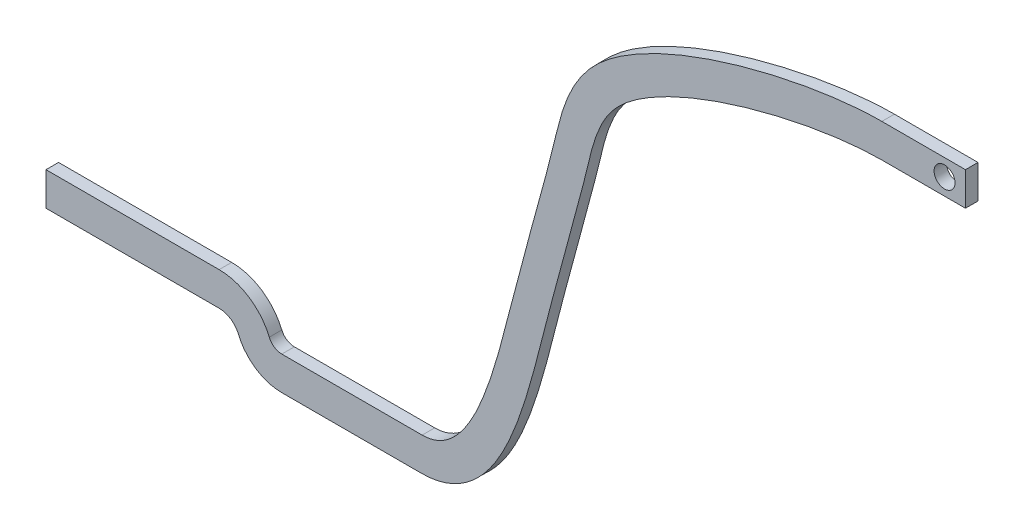
ISO-10303-21;
HEADER;
FILE_DESCRIPTION(('STEP AP214'),'2;1');
FILE_NAME('part.step','',(''),(''),'','','');
FILE_SCHEMA(('AUTOMOTIVE_DESIGN { 1 0 10303 214 1 1 1 1 }'));
ENDSEC;
DATA;
#1=APPLICATION_CONTEXT('core data for automotive mechanical design processes');
#2=APPLICATION_PROTOCOL_DEFINITION('international standard','automotive_design',2000,#1);
#3=PRODUCT_CONTEXT('',#1,'mechanical');
#4=PRODUCT('Part','Part','',(#3));
#5=PRODUCT_RELATED_PRODUCT_CATEGORY('part','',(#4));
#6=PRODUCT_DEFINITION_FORMATION('','',#4);
#7=PRODUCT_DEFINITION_CONTEXT('part definition',#1,'design');
#8=PRODUCT_DEFINITION('design','',#6,#7);
#9=PRODUCT_DEFINITION_SHAPE('','',#8);
#10=(LENGTH_UNIT() NAMED_UNIT(*) SI_UNIT(.MILLI.,.METRE.));
#11=(NAMED_UNIT(*) PLANE_ANGLE_UNIT() SI_UNIT($,.RADIAN.));
#12=(NAMED_UNIT(*) SI_UNIT($,.STERADIAN.) SOLID_ANGLE_UNIT());
#13=UNCERTAINTY_MEASURE_WITH_UNIT(LENGTH_MEASURE(1.E-05),#10,'distance_accuracy_value','');
#14=(GEOMETRIC_REPRESENTATION_CONTEXT(3) GLOBAL_UNCERTAINTY_ASSIGNED_CONTEXT((#13)) GLOBAL_UNIT_ASSIGNED_CONTEXT((#10,
#11,#12)) REPRESENTATION_CONTEXT('',''));
#15=CARTESIAN_POINT('',(0.,0.,0.));
#16=DIRECTION('',(0.,0.,1.));
#17=DIRECTION('',(1.,0.,0.));
#18=AXIS2_PLACEMENT_3D('',#15,#16,#17);
#19=CARTESIAN_POINT('',(0.,0.,3.));
#20=DIRECTION('',(1.,0.,0.));
#21=DIRECTION('',(0.,1.,0.));
#22=AXIS2_PLACEMENT_3D('',#19,#20,#21);
#23=PLANE('',#22);
#24=DIRECTION('',(0.,-1.,0.));
#25=VECTOR('',#24,1.);
#26=CARTESIAN_POINT('',(0.,0.,0.));
#27=LINE('',#26,#25);
#28=CARTESIAN_POINT('',(0.,0.,0.));
#29=VERTEX_POINT('',#28);
#30=CARTESIAN_POINT('',(0.,-8.,0.));
#31=VERTEX_POINT('',#30);
#32=EDGE_CURVE('E166',#29,#31,#27,.T.);
#33=ORIENTED_EDGE('',*,*,#32,.T.);
#34=DIRECTION('',(0.,0.,-1.));
#35=VECTOR('',#34,1.);
#36=CARTESIAN_POINT('',(0.,-8.,3.));
#37=LINE('',#36,#35);
#38=CARTESIAN_POINT('',(0.,-8.,3.));
#39=VERTEX_POINT('',#38);
#40=EDGE_CURVE('E11',#39,#31,#37,.T.);
#41=ORIENTED_EDGE('',*,*,#40,.F.);
#42=DIRECTION('',(0.,-1.,0.));
#43=VECTOR('',#42,1.);
#44=CARTESIAN_POINT('',(0.,0.,3.));
#45=LINE('',#44,#43);
#46=CARTESIAN_POINT('',(0.,0.,3.));
#47=VERTEX_POINT('',#46);
#48=EDGE_CURVE('E210',#47,#39,#45,.T.);
#49=ORIENTED_EDGE('',*,*,#48,.F.);
#50=DIRECTION('',(0.,0.,-1.));
#51=VECTOR('',#50,1.);
#52=CARTESIAN_POINT('',(0.,0.,3.));
#53=LINE('',#52,#51);
#54=EDGE_CURVE('E49',#47,#29,#53,.T.);
#55=ORIENTED_EDGE('',*,*,#54,.T.);
#56=EDGE_LOOP('',(#33,#41,#49,#55));
#57=FACE_BOUND('',#56,.T.);
#58=ADVANCED_FACE('F33',(#57),#23,.F.);
#59=CARTESIAN_POINT('',(0.,-8.,3.));
#60=DIRECTION('',(0.,1.,0.));
#61=DIRECTION('',(-1.,0.,0.));
#62=AXIS2_PLACEMENT_3D('',#59,#60,#61);
#63=PLANE('',#62);
#64=DIRECTION('',(1.,0.,0.));
#65=VECTOR('',#64,1.);
#66=CARTESIAN_POINT('',(0.,-8.,0.));
#67=LINE('',#66,#65);
#68=CARTESIAN_POINT('',(41.4247575020263,-8.,0.));
#69=VERTEX_POINT('',#68);
#70=EDGE_CURVE('E168',#31,#69,#67,.T.);
#71=ORIENTED_EDGE('',*,*,#70,.T.);
#72=DIRECTION('',(0.,0.,-1.));
#73=VECTOR('',#72,1.);
#74=CARTESIAN_POINT('',(41.4247575020263,-8.,3.));
#75=LINE('',#74,#73);
#76=CARTESIAN_POINT('',(41.4247575020263,-8.,3.));
#77=VERTEX_POINT('',#76);
#78=EDGE_CURVE('E41',#77,#69,#75,.T.);
#79=ORIENTED_EDGE('',*,*,#78,.F.);
#80=DIRECTION('',(1.,0.,0.));
#81=VECTOR('',#80,1.);
#82=CARTESIAN_POINT('',(0.,-8.,3.));
#83=LINE('',#82,#81);
#84=EDGE_CURVE('E105',#39,#77,#83,.T.);
#85=ORIENTED_EDGE('',*,*,#84,.F.);
#86=ORIENTED_EDGE('',*,*,#40,.T.);
#87=EDGE_LOOP('',(#71,#79,#85,#86));
#88=FACE_BOUND('',#87,.T.);
#89=ADVANCED_FACE('F283',(#88),#63,.F.);
#90=CARTESIAN_POINT('',(41.4247575020263,-13.,3.));
#91=DIRECTION('',(0.,0.,-1.));
#92=DIRECTION('',(-1.,0.,0.));
#93=AXIS2_PLACEMENT_3D('',#90,#91,#92);
#94=CYLINDRICAL_SURFACE('',#93,5.);
#95=CARTESIAN_POINT('',(41.4247575020263,-13.,0.));
#96=DIRECTION('',(0.,0.,-1.));
#97=DIRECTION('',(-1.,0.,0.));
#98=AXIS2_PLACEMENT_3D('',#95,#96,#97);
#99=CIRCLE('',#98,5.);
#100=CARTESIAN_POINT('',(46.040142117411,-11.0769230769231,0.));
#101=VERTEX_POINT('',#100);
#102=EDGE_CURVE('E171',#69,#101,#99,.T.);
#103=ORIENTED_EDGE('',*,*,#102,.T.);
#104=DIRECTION('',(0.,0.,-1.));
#105=VECTOR('',#104,1.);
#106=CARTESIAN_POINT('',(46.040142117411,-11.0769230769231,3.));
#107=LINE('',#106,#105);
#108=CARTESIAN_POINT('',(46.040142117411,-11.0769230769231,3.));
#109=VERTEX_POINT('',#108);
#110=EDGE_CURVE('E231',#109,#101,#107,.T.);
#111=ORIENTED_EDGE('',*,*,#110,.F.);
#112=CARTESIAN_POINT('',(41.4247575020263,-13.,3.));
#113=DIRECTION('',(0.,0.,-1.));
#114=DIRECTION('',(-1.,0.,0.));
#115=AXIS2_PLACEMENT_3D('',#112,#113,#114);
#116=CIRCLE('',#115,5.);
#117=EDGE_CURVE('E239',#77,#109,#116,.T.);
#118=ORIENTED_EDGE('',*,*,#117,.F.);
#119=ORIENTED_EDGE('',*,*,#78,.T.);
#120=EDGE_LOOP('',(#103,#111,#118,#119));
#121=FACE_BOUND('',#120,.T.);
#122=ADVANCED_FACE('F237',(#121),#94,.F.);
#123=CARTESIAN_POINT('',(56.4247574581034,-6.75000001830122,3.));
#124=DIRECTION('',(0.,0.,-1.));
#125=DIRECTION('',(-1.,0.,0.));
#126=AXIS2_PLACEMENT_3D('',#123,#124,#125);
#127=CYLINDRICAL_SURFACE('',#126,11.2499999524168);
#128=CARTESIAN_POINT('',(56.4247574581034,-6.75000001830122,0.));
#129=DIRECTION('',(0.,0.,1.));
#130=DIRECTION('',(1.,0.,0.));
#131=AXIS2_PLACEMENT_3D('',#128,#129,#130);
#132=CIRCLE('',#131,11.2499999524168);
#133=CARTESIAN_POINT('',(56.4247574581034,-17.9999999707181,0.));
#134=VERTEX_POINT('',#133);
#135=EDGE_CURVE('E173',#101,#134,#132,.T.);
#136=ORIENTED_EDGE('',*,*,#135,.T.);
#137=DIRECTION('',(0.,0.,-1.));
#138=VECTOR('',#137,1.);
#139=CARTESIAN_POINT('',(56.4247574581034,-17.9999999707181,3.));
#140=LINE('',#139,#138);
#141=CARTESIAN_POINT('',(56.4247574581034,-17.9999999707181,3.));
#142=VERTEX_POINT('',#141);
#143=EDGE_CURVE('E228',#142,#134,#140,.T.);
#144=ORIENTED_EDGE('',*,*,#143,.F.);
#145=CARTESIAN_POINT('',(56.4247574581034,-6.75000001830122,3.));
#146=DIRECTION('',(0.,0.,1.));
#147=DIRECTION('',(1.,0.,0.));
#148=AXIS2_PLACEMENT_3D('',#145,#146,#147);
#149=CIRCLE('',#148,11.2499999524168);
#150=EDGE_CURVE('E256',#109,#142,#149,.T.);
#151=ORIENTED_EDGE('',*,*,#150,.F.);
#152=ORIENTED_EDGE('',*,*,#110,.T.);
#153=EDGE_LOOP('',(#136,#144,#151,#152));
#154=FACE_BOUND('',#153,.T.);
#155=ADVANCED_FACE('F247',(#154),#127,.T.);
#156=CARTESIAN_POINT('',(56.4247574581034,-17.9999999707181,3.));
#157=DIRECTION('',(0.,1.,0.));
#158=DIRECTION('',(0.,0.,1.));
#159=AXIS2_PLACEMENT_3D('',#156,#157,#158);
#160=PLANE('',#159);
#161=DIRECTION('',(1.,0.,0.));
#162=VECTOR('',#161,1.);
#163=CARTESIAN_POINT('',(56.4247574581034,-17.9999999707181,0.));
#164=LINE('',#163,#162);
#165=CARTESIAN_POINT('',(89.7568384061287,-17.9999999707181,0.));
#166=VERTEX_POINT('',#165);
#167=EDGE_CURVE('E175',#134,#166,#164,.T.);
#168=ORIENTED_EDGE('',*,*,#167,.T.);
#169=DIRECTION('',(0.,0.,-1.));
#170=VECTOR('',#169,1.);
#171=CARTESIAN_POINT('',(89.7568384061287,-17.9999999707181,3.));
#172=LINE('',#171,#170);
#173=CARTESIAN_POINT('',(89.7568384061287,-17.9999999707181,3.));
#174=VERTEX_POINT('',#173);
#175=EDGE_CURVE('E225',#174,#166,#172,.T.);
#176=ORIENTED_EDGE('',*,*,#175,.F.);
#177=DIRECTION('',(1.,0.,0.));
#178=VECTOR('',#177,1.);
#179=CARTESIAN_POINT('',(56.4247574581034,-17.9999999707181,3.));
#180=LINE('',#179,#178);
#181=EDGE_CURVE('E253',#142,#174,#180,.T.);
#182=ORIENTED_EDGE('',*,*,#181,.F.);
#183=ORIENTED_EDGE('',*,*,#143,.T.);
#184=EDGE_LOOP('',(#168,#176,#182,#183));
#185=FACE_BOUND('',#184,.T.);
#186=ADVANCED_FACE('F251',(#185),#160,.F.);
#187=CARTESIAN_POINT('',(89.7568384061287,-17.9999999707181,3.));
#188=CARTESIAN_POINT('',(89.8130917953654,-17.9999999707181,3.));
#189=CARTESIAN_POINT('',(89.9023489366075,-17.9999160095133,3.));
#190=CARTESIAN_POINT('',(90.0018502287152,-18.0001399060593,3.));
#191=CARTESIAN_POINT('',(90.2310859563055,-17.9991712431685,3.));
#192=CARTESIAN_POINT('',(90.4729508911273,-17.9945024665527,3.));
#193=CARTESIAN_POINT('',(90.8841416796012,-17.9801542162149,3.));
#194=CARTESIAN_POINT('',(91.3881278747203,-17.9490844411562,3.));
#195=CARTESIAN_POINT('',(92.1947585178213,-17.8715614192402,3.));
#196=CARTESIAN_POINT('',(93.1904500807991,-17.7228676596242,3.));
#197=CARTESIAN_POINT('',(94.7507448217479,-17.3781896295835,3.));
#198=CARTESIAN_POINT('',(96.6187354886936,-16.7576735377139,3.));
#199=CARTESIAN_POINT('',(99.3770892643854,-15.4234498958376,3.));
#200=CARTESIAN_POINT('',(102.343197713656,-13.2590682721257,3.));
#201=CARTESIAN_POINT('',(106.17490080248,-9.1892750607975,3.));
#202=CARTESIAN_POINT('',(109.735071262154,-3.38671783364758,3.));
#203=CARTESIAN_POINT('',(112.961674589915,4.24643864543277,3.));
#204=CARTESIAN_POINT('',(115.514327900771,12.179197087228,3.));
#205=CARTESIAN_POINT('',(117.251666845729,18.6295501585535,3.));
#206=CARTESIAN_POINT('',(118.474102134264,23.4122051084266,3.));
#207=CARTESIAN_POINT('',(119.602496230846,27.8231118813068,3.));
#208=CARTESIAN_POINT('',(120.898538707965,32.7925609769524,3.));
#209=CARTESIAN_POINT('',(122.284194923136,38.0013127138926,3.));
#210=CARTESIAN_POINT('',(123.943196149883,44.1257145868726,3.));
#211=CARTESIAN_POINT('',(125.369626288269,49.2900964405528,3.));
#212=CARTESIAN_POINT('',(126.66639279542,54.0396640218425,3.));
#213=CARTESIAN_POINT('',(127.59755822836,57.5238674831548,3.));
#214=CARTESIAN_POINT('',(128.358235989521,60.4702597519119,3.));
#215=CARTESIAN_POINT('',(128.966266021768,62.9054224339843,3.));
#216=CARTESIAN_POINT('',(129.429299712865,64.806090195796,3.));
#217=CARTESIAN_POINT('',(129.883035302883,66.7129030321821,3.));
#218=CARTESIAN_POINT('',(130.492374677473,69.1710238981108,3.));
#219=CARTESIAN_POINT('',(131.670627829012,73.3006930437622,3.));
#220=CARTESIAN_POINT('',(133.543133303097,77.4976440574227,3.));
#221=CARTESIAN_POINT('',(136.170909387328,80.8434015218557,3.));
#222=CARTESIAN_POINT('',(138.117867338206,82.7220877727008,3.));
#223=CARTESIAN_POINT('',(140.506133762764,84.6808821665961,3.));
#224=CARTESIAN_POINT('',(144.208061635852,87.1527292751961,3.));
#225=CARTESIAN_POINT('',(149.590597904857,90.0085545042913,3.));
#226=CARTESIAN_POINT('',(155.679808934853,92.6582574887067,3.));
#227=CARTESIAN_POINT('',(162.257603089206,95.0444001444545,3.));
#228=CARTESIAN_POINT('',(169.111801490595,97.1263121647057,3.));
#229=CARTESIAN_POINT('',(176.035239222022,98.8731488050805,3.));
#230=CARTESIAN_POINT('',(182.821256281701,100.259557815344,3.));
#231=CARTESIAN_POINT('',(188.187246712887,101.096565943295,3.));
#232=CARTESIAN_POINT('',(192.194993207786,101.566634814564,3.));
#233=CARTESIAN_POINT('',(195.030088806438,101.818031656257,3.));
#234=CARTESIAN_POINT('',(197.217185842128,101.942662864324,3.));
#235=CARTESIAN_POINT('',(198.857928811693,101.991927711802,3.));
#236=CARTESIAN_POINT('',(199.613923387014,102.000004856737,3.));
#237=CARTESIAN_POINT('',(200.,102.000004856737,3.));
#238=B_SPLINE_CURVE_WITH_KNOTS('',3,(#187,#188,#189,#190,#191,#192,#193,#194,#195,#196,#197,
#198,#199,#200,#201,#202,#203,#204,#205,#206,#207,#208,#209,#210,#211,#212,#213,#214,#215,#216,
#217,#218,#219,#220,#221,#222,#223,#224,#225,#226,#227,#228,#229,#230,#231,#232,#233,#234,#235,
#236,#237),.UNSPECIFIED.,.F.,.F.,(4,1,1,1,1,1,1,1,1,1,1,1,1,1,1,1,1,1,1,1,1,1,1,1,1,1,1,1,1,1,1,
1,1,1,1,1,1,1,1,1,1,1,1,1,1,1,1,1,4),(-0.00140908308889591,-0.000431144531191907,
5.78247476600933E-05,0.000546794026512093,0.00152473258421609,0.00250267114192009,
0.00445854825732809,0.00641442537273609,0.0103261796035521,0.0142379338343681,
0.0220614422960001,0.0298849507576321,0.0455319676808961,0.0611789846041601,0.0924730184506881,
0.123767052297216,0.155061086143744,0.186355119990272,0.202002136913536,0.2176491538368,
0.248943187683328,0.280237221529856,0.311531255376384,0.37411932306944,0.405413356915968,
0.436707390762496,0.468001424609024,0.483648441532288,0.499295458455552,0.514942475378816,
0.53058949230208,0.561883526148608,0.624471593841664,0.655765627688192,0.671412644611456,
0.68705966153472,0.718353695381248,0.749647729227776,0.780941763074304,0.812235796920832,
0.84352983076736,0.874823864613888,0.906117898460416,0.937411932306944,0.953058949230208,
0.968705966153472,0.984352983076736,0.992176491538368,1.),.UNSPECIFIED.);
#239=DIRECTION('',(0.,0.,-1.));
#240=VECTOR('',#239,1.);
#241=SURFACE_OF_LINEAR_EXTRUSION('',#238,#240);
#242=CARTESIAN_POINT('',(89.7568384061287,-17.9999999707181,0.));
#243=CARTESIAN_POINT('',(89.8130917953654,-17.9999999707181,0.));
#244=CARTESIAN_POINT('',(89.9023489366075,-17.9999160095133,0.));
#245=CARTESIAN_POINT('',(90.0018502287152,-18.0001399060593,0.));
#246=CARTESIAN_POINT('',(90.2310859563055,-17.9991712431685,0.));
#247=CARTESIAN_POINT('',(90.4729508911273,-17.9945024665527,0.));
#248=CARTESIAN_POINT('',(90.8841416796012,-17.9801542162149,0.));
#249=CARTESIAN_POINT('',(91.3881278747203,-17.9490844411562,0.));
#250=CARTESIAN_POINT('',(92.1947585178213,-17.8715614192402,0.));
#251=CARTESIAN_POINT('',(93.1904500807991,-17.7228676596242,0.));
#252=CARTESIAN_POINT('',(94.7507448217479,-17.3781896295835,0.));
#253=CARTESIAN_POINT('',(96.6187354886936,-16.7576735377139,0.));
#254=CARTESIAN_POINT('',(99.3770892643854,-15.4234498958376,0.));
#255=CARTESIAN_POINT('',(102.343197713656,-13.2590682721257,0.));
#256=CARTESIAN_POINT('',(106.17490080248,-9.1892750607975,0.));
#257=CARTESIAN_POINT('',(109.735071262154,-3.38671783364758,0.));
#258=CARTESIAN_POINT('',(112.961674589915,4.24643864543277,0.));
#259=CARTESIAN_POINT('',(115.514327900771,12.179197087228,0.));
#260=CARTESIAN_POINT('',(117.251666845729,18.6295501585535,0.));
#261=CARTESIAN_POINT('',(118.474102134264,23.4122051084266,0.));
#262=CARTESIAN_POINT('',(119.602496230846,27.8231118813068,0.));
#263=CARTESIAN_POINT('',(120.898538707965,32.7925609769524,0.));
#264=CARTESIAN_POINT('',(122.284194923136,38.0013127138926,0.));
#265=CARTESIAN_POINT('',(123.943196149883,44.1257145868726,0.));
#266=CARTESIAN_POINT('',(125.369626288269,49.2900964405528,0.));
#267=CARTESIAN_POINT('',(126.66639279542,54.0396640218425,0.));
#268=CARTESIAN_POINT('',(127.59755822836,57.5238674831548,0.));
#269=CARTESIAN_POINT('',(128.358235989521,60.4702597519119,0.));
#270=CARTESIAN_POINT('',(128.966266021768,62.9054224339843,0.));
#271=CARTESIAN_POINT('',(129.429299712865,64.806090195796,0.));
#272=CARTESIAN_POINT('',(129.883035302883,66.7129030321821,0.));
#273=CARTESIAN_POINT('',(130.492374677473,69.1710238981108,0.));
#274=CARTESIAN_POINT('',(131.670627829012,73.3006930437622,0.));
#275=CARTESIAN_POINT('',(133.543133303097,77.4976440574227,0.));
#276=CARTESIAN_POINT('',(136.170909387328,80.8434015218557,0.));
#277=CARTESIAN_POINT('',(138.117867338206,82.7220877727008,0.));
#278=CARTESIAN_POINT('',(140.506133762764,84.6808821665961,0.));
#279=CARTESIAN_POINT('',(144.208061635852,87.1527292751961,0.));
#280=CARTESIAN_POINT('',(149.590597904857,90.0085545042913,0.));
#281=CARTESIAN_POINT('',(155.679808934853,92.6582574887067,0.));
#282=CARTESIAN_POINT('',(162.257603089206,95.0444001444545,0.));
#283=CARTESIAN_POINT('',(169.111801490595,97.1263121647057,0.));
#284=CARTESIAN_POINT('',(176.035239222022,98.8731488050805,0.));
#285=CARTESIAN_POINT('',(182.821256281701,100.259557815344,0.));
#286=CARTESIAN_POINT('',(188.187246712887,101.096565943295,0.));
#287=CARTESIAN_POINT('',(192.194993207786,101.566634814564,0.));
#288=CARTESIAN_POINT('',(195.030088806438,101.818031656257,0.));
#289=CARTESIAN_POINT('',(197.217185842128,101.942662864324,0.));
#290=CARTESIAN_POINT('',(198.857928811693,101.991927711802,0.));
#291=CARTESIAN_POINT('',(199.613923387014,102.000004856737,0.));
#292=CARTESIAN_POINT('',(200.,102.000004856737,0.));
#293=B_SPLINE_CURVE_WITH_KNOTS('',3,(#242,#243,#244,#245,#246,#247,#248,#249,#250,#251,#252,
#253,#254,#255,#256,#257,#258,#259,#260,#261,#262,#263,#264,#265,#266,#267,#268,#269,#270,#271,
#272,#273,#274,#275,#276,#277,#278,#279,#280,#281,#282,#283,#284,#285,#286,#287,#288,#289,#290,
#291,#292),.UNSPECIFIED.,.F.,.F.,(4,1,1,1,1,1,1,1,1,1,1,1,1,1,1,1,1,1,1,1,1,1,1,1,1,1,1,1,1,1,1,
1,1,1,1,1,1,1,1,1,1,1,1,1,1,1,1,1,4),(-0.00140908308889591,-0.000431144531191907,
5.78247476600933E-05,0.000546794026512093,0.00152473258421609,0.00250267114192009,
0.00445854825732809,0.00641442537273609,0.0103261796035521,0.0142379338343681,
0.0220614422960001,0.0298849507576321,0.0455319676808961,0.0611789846041601,0.0924730184506881,
0.123767052297216,0.155061086143744,0.186355119990272,0.202002136913536,0.2176491538368,
0.248943187683328,0.280237221529856,0.311531255376384,0.37411932306944,0.405413356915968,
0.436707390762496,0.468001424609024,0.483648441532288,0.499295458455552,0.514942475378816,
0.53058949230208,0.561883526148608,0.624471593841664,0.655765627688192,0.671412644611456,
0.68705966153472,0.718353695381248,0.749647729227776,0.780941763074304,0.812235796920832,
0.84352983076736,0.874823864613888,0.906117898460416,0.937411932306944,0.953058949230208,
0.968705966153472,0.984352983076736,0.992176491538368,1.),.UNSPECIFIED.);
#294=CARTESIAN_POINT('',(200.,102.000004856737,0.));
#295=VERTEX_POINT('',#294);
#296=EDGE_CURVE('E177',#166,#295,#293,.T.);
#297=ORIENTED_EDGE('',*,*,#296,.T.);
#298=DIRECTION('',(0.,0.,-1.));
#299=VECTOR('',#298,1.);
#300=CARTESIAN_POINT('',(200.,102.000004856737,3.));
#301=LINE('',#300,#299);
#302=CARTESIAN_POINT('',(200.,102.000004856737,3.));
#303=VERTEX_POINT('',#302);
#304=EDGE_CURVE('E222',#303,#295,#301,.T.);
#305=ORIENTED_EDGE('',*,*,#304,.F.);
#306=EDGE_CURVE('E255',#174,#303,#238,.T.);
#307=ORIENTED_EDGE('',*,*,#306,.F.);
#308=ORIENTED_EDGE('',*,*,#175,.T.);
#309=EDGE_LOOP('',(#297,#305,#307,#308));
#310=FACE_BOUND('',#309,.T.);
#311=ADVANCED_FACE('F271',(#310),#241,.F.);
#312=CARTESIAN_POINT('',(200.,102.000004856737,3.));
#313=DIRECTION('',(0.,1.,0.));
#314=DIRECTION('',(0.,0.,1.));
#315=AXIS2_PLACEMENT_3D('',#312,#313,#314);
#316=PLANE('',#315);
#317=DIRECTION('',(1.,0.,0.));
#318=VECTOR('',#317,1.);
#319=CARTESIAN_POINT('',(200.,102.000004856737,0.));
#320=LINE('',#319,#318);
#321=CARTESIAN_POINT('',(220.,102.000004856737,0.));
#322=VERTEX_POINT('',#321);
#323=EDGE_CURVE('E181',#295,#322,#320,.T.);
#324=ORIENTED_EDGE('',*,*,#323,.T.);
#325=DIRECTION('',(0.,0.,-1.));
#326=VECTOR('',#325,1.);
#327=CARTESIAN_POINT('',(220.,102.000004856737,3.));
#328=LINE('',#327,#326);
#329=CARTESIAN_POINT('',(220.,102.000004856737,3.));
#330=VERTEX_POINT('',#329);
#331=EDGE_CURVE('E220',#330,#322,#328,.T.);
#332=ORIENTED_EDGE('',*,*,#331,.F.);
#333=DIRECTION('',(1.,0.,0.));
#334=VECTOR('',#333,1.);
#335=CARTESIAN_POINT('',(200.,102.000004856737,3.));
#336=LINE('',#335,#334);
#337=EDGE_CURVE('E258',#303,#330,#336,.T.);
#338=ORIENTED_EDGE('',*,*,#337,.F.);
#339=ORIENTED_EDGE('',*,*,#304,.T.);
#340=EDGE_LOOP('',(#324,#332,#338,#339));
#341=FACE_BOUND('',#340,.T.);
#342=ADVANCED_FACE('F275',(#341),#316,.F.);
#343=CARTESIAN_POINT('',(220.,110.000004856737,3.));
#344=DIRECTION('',(1.,0.,0.));
#345=DIRECTION('',(0.,0.,-1.));
#346=AXIS2_PLACEMENT_3D('',#343,#344,#345);
#347=PLANE('',#346);
#348=DIRECTION('',(0.,-1.,0.));
#349=VECTOR('',#348,1.);
#350=CARTESIAN_POINT('',(220.,110.000004856737,0.));
#351=LINE('',#350,#349);
#352=CARTESIAN_POINT('',(220.,110.000004856737,0.));
#353=VERTEX_POINT('',#352);
#354=EDGE_CURVE('E187',#353,#322,#351,.T.);
#355=ORIENTED_EDGE('',*,*,#354,.F.);
#356=DIRECTION('',(0.,0.,-1.));
#357=VECTOR('',#356,1.);
#358=CARTESIAN_POINT('',(220.,110.000004856737,3.));
#359=LINE('',#358,#357);
#360=CARTESIAN_POINT('',(220.,110.000004856737,3.));
#361=VERTEX_POINT('',#360);
#362=EDGE_CURVE('E218',#361,#353,#359,.T.);
#363=ORIENTED_EDGE('',*,*,#362,.F.);
#364=DIRECTION('',(0.,-1.,0.));
#365=VECTOR('',#364,1.);
#366=CARTESIAN_POINT('',(220.,110.000004856737,3.));
#367=LINE('',#366,#365);
#368=EDGE_CURVE('E339',#361,#330,#367,.T.);
#369=ORIENTED_EDGE('',*,*,#368,.T.);
#370=ORIENTED_EDGE('',*,*,#331,.T.);
#371=EDGE_LOOP('',(#355,#363,#369,#370));
#372=FACE_BOUND('',#371,.T.);
#373=ADVANCED_FACE('F333',(#372),#347,.T.);
#374=CARTESIAN_POINT('',(200.,110.000004856737,3.));
#375=DIRECTION('',(0.,1.,0.));
#376=DIRECTION('',(0.,0.,1.));
#377=AXIS2_PLACEMENT_3D('',#374,#375,#376);
#378=PLANE('',#377);
#379=DIRECTION('',(1.,0.,0.));
#380=VECTOR('',#379,1.);
#381=CARTESIAN_POINT('',(200.,110.000004856737,0.));
#382=LINE('',#381,#380);
#383=CARTESIAN_POINT('',(200.,110.000004856737,0.));
#384=VERTEX_POINT('',#383);
#385=EDGE_CURVE('E190',#384,#353,#382,.T.);
#386=ORIENTED_EDGE('',*,*,#385,.F.);
#387=DIRECTION('',(0.,0.,-1.));
#388=VECTOR('',#387,1.);
#389=CARTESIAN_POINT('',(200.,110.000004856737,3.));
#390=LINE('',#389,#388);
#391=CARTESIAN_POINT('',(200.,110.000004856737,3.));
#392=VERTEX_POINT('',#391);
#393=EDGE_CURVE('E216',#392,#384,#390,.T.);
#394=ORIENTED_EDGE('',*,*,#393,.F.);
#395=DIRECTION('',(1.,0.,0.));
#396=VECTOR('',#395,1.);
#397=CARTESIAN_POINT('',(200.,110.000004856737,3.));
#398=LINE('',#397,#396);
#399=EDGE_CURVE('E319',#392,#361,#398,.T.);
#400=ORIENTED_EDGE('',*,*,#399,.T.);
#401=ORIENTED_EDGE('',*,*,#362,.T.);
#402=EDGE_LOOP('',(#386,#394,#400,#401));
#403=FACE_BOUND('',#402,.T.);
#404=ADVANCED_FACE('F311',(#403),#378,.T.);
#405=CARTESIAN_POINT('',(90.,-9.99999997071806,3.));
#406=CARTESIAN_POINT('',(101.943214860217,-9.99999997071806,3.));
#407=CARTESIAN_POINT('',(114.607926466483,42.0844830284497,3.));
#408=CARTESIAN_POINT('',(120.208592324082,59.1821350409066,3.));
#409=CARTESIAN_POINT('',(128.348937953731,97.0978624950908,3.));
#410=CARTESIAN_POINT('',(181.297657620423,110.000004856737,3.));
#411=CARTESIAN_POINT('',(200.,110.000004856737,3.));
#412=B_SPLINE_CURVE_WITH_KNOTS('',3,(#405,#406,#407,#408,#409,#410,#411),.UNSPECIFIED.,.F.,.F.,
(4,1,1,1,4),(0.,0.207627139861837,0.498806021872266,0.661293052542363,1.),.UNSPECIFIED.);
#413=DIRECTION('',(0.,0.,-1.));
#414=VECTOR('',#413,1.);
#415=SURFACE_OF_LINEAR_EXTRUSION('',#412,#414);
#416=CARTESIAN_POINT('',(90.,-9.99999997071806,0.));
#417=CARTESIAN_POINT('',(101.943214860217,-9.99999997071806,0.));
#418=CARTESIAN_POINT('',(114.607926466483,42.0844830284497,0.));
#419=CARTESIAN_POINT('',(120.208592324082,59.1821350409066,0.));
#420=CARTESIAN_POINT('',(128.348937953731,97.0978624950908,0.));
#421=CARTESIAN_POINT('',(181.297657620423,110.000004856737,0.));
#422=CARTESIAN_POINT('',(200.,110.000004856737,0.));
#423=B_SPLINE_CURVE_WITH_KNOTS('',3,(#416,#417,#418,#419,#420,#421,#422),.UNSPECIFIED.,.F.,.F.,
(4,1,1,1,4),(0.,0.207627139861837,0.498806021872266,0.661293052542363,1.),.UNSPECIFIED.);
#424=CARTESIAN_POINT('',(90.,-9.99999997071806,0.));
#425=VERTEX_POINT('',#424);
#426=EDGE_CURVE('E193',#425,#384,#423,.T.);
#427=ORIENTED_EDGE('',*,*,#426,.F.);
#428=DIRECTION('',(0.,0.,-1.));
#429=VECTOR('',#428,1.);
#430=CARTESIAN_POINT('',(90.,-9.99999997071806,3.));
#431=LINE('',#430,#429);
#432=CARTESIAN_POINT('',(90.,-9.99999997071806,3.));
#433=VERTEX_POINT('',#432);
#434=EDGE_CURVE('E214',#433,#425,#431,.T.);
#435=ORIENTED_EDGE('',*,*,#434,.F.);
#436=EDGE_CURVE('E313',#433,#392,#412,.T.);
#437=ORIENTED_EDGE('',*,*,#436,.T.);
#438=ORIENTED_EDGE('',*,*,#393,.T.);
#439=EDGE_LOOP('',(#427,#435,#437,#438));
#440=FACE_BOUND('',#439,.T.);
#441=ADVANCED_FACE('F306',(#440),#415,.T.);
#442=CARTESIAN_POINT('',(56.4247574581034,-9.99999997071805,3.));
#443=DIRECTION('',(0.,1.,0.));
#444=DIRECTION('',(-1.,0.,0.));
#445=AXIS2_PLACEMENT_3D('',#442,#443,#444);
#446=PLANE('',#445);
#447=DIRECTION('',(1.,0.,0.));
#448=VECTOR('',#447,1.);
#449=CARTESIAN_POINT('',(56.4247574581034,-9.99999997071805,0.));
#450=LINE('',#449,#448);
#451=CARTESIAN_POINT('',(56.4247574581034,-9.99999997071805,0.));
#452=VERTEX_POINT('',#451);
#453=EDGE_CURVE('E198',#452,#425,#450,.T.);
#454=ORIENTED_EDGE('',*,*,#453,.F.);
#455=DIRECTION('',(0.,0.,-1.));
#456=VECTOR('',#455,1.);
#457=CARTESIAN_POINT('',(56.4247574581034,-9.99999997071805,3.));
#458=LINE('',#457,#456);
#459=CARTESIAN_POINT('',(56.4247574581034,-9.99999997071805,3.));
#460=VERTEX_POINT('',#459);
#461=EDGE_CURVE('E148',#460,#452,#458,.T.);
#462=ORIENTED_EDGE('',*,*,#461,.F.);
#463=DIRECTION('',(1.,0.,0.));
#464=VECTOR('',#463,1.);
#465=CARTESIAN_POINT('',(56.4247574581034,-9.99999997071805,3.));
#466=LINE('',#465,#464);
#467=EDGE_CURVE('E158',#460,#433,#466,.T.);
#468=ORIENTED_EDGE('',*,*,#467,.T.);
#469=ORIENTED_EDGE('',*,*,#434,.T.);
#470=EDGE_LOOP('',(#454,#462,#468,#469));
#471=FACE_BOUND('',#470,.T.);
#472=ADVANCED_FACE('F303',(#471),#446,.T.);
#473=CARTESIAN_POINT('',(56.4247574581034,-6.75000001830122,3.));
#474=DIRECTION('',(0.,0.,-1.));
#475=DIRECTION('',(-1.,0.,0.));
#476=AXIS2_PLACEMENT_3D('',#473,#474,#475);
#477=CYLINDRICAL_SURFACE('',#476,3.24999995241683);
#478=CARTESIAN_POINT('',(56.4247574581034,-6.75000001830122,0.));
#479=DIRECTION('',(0.,0.,1.));
#480=DIRECTION('',(1.,0.,0.));
#481=AXIS2_PLACEMENT_3D('',#478,#479,#480);
#482=CIRCLE('',#481,3.24999995241683);
#483=CARTESIAN_POINT('',(53.4247575020263,-8.,0.));
#484=VERTEX_POINT('',#483);
#485=EDGE_CURVE('E144',#484,#452,#482,.T.);
#486=ORIENTED_EDGE('',*,*,#485,.F.);
#487=DIRECTION('',(0.,0.,-1.));
#488=VECTOR('',#487,1.);
#489=CARTESIAN_POINT('',(53.4247575020263,-8.,3.));
#490=LINE('',#489,#488);
#491=CARTESIAN_POINT('',(53.4247575020263,-8.,3.));
#492=VERTEX_POINT('',#491);
#493=EDGE_CURVE('E139',#492,#484,#490,.T.);
#494=ORIENTED_EDGE('',*,*,#493,.F.);
#495=CARTESIAN_POINT('',(56.4247574581034,-6.75000001830122,3.));
#496=DIRECTION('',(0.,0.,1.));
#497=DIRECTION('',(1.,0.,0.));
#498=AXIS2_PLACEMENT_3D('',#495,#496,#497);
#499=CIRCLE('',#498,3.24999995241683);
#500=EDGE_CURVE('E142',#492,#460,#499,.T.);
#501=ORIENTED_EDGE('',*,*,#500,.T.);
#502=ORIENTED_EDGE('',*,*,#461,.T.);
#503=EDGE_LOOP('',(#486,#494,#501,#502));
#504=FACE_BOUND('',#503,.T.);
#505=ADVANCED_FACE('F141',(#504),#477,.F.);
#506=CARTESIAN_POINT('',(41.4247575020263,-13.,3.));
#507=DIRECTION('',(0.,0.,-1.));
#508=DIRECTION('',(-1.,0.,0.));
#509=AXIS2_PLACEMENT_3D('',#506,#507,#508);
#510=CYLINDRICAL_SURFACE('',#509,13.);
#511=CARTESIAN_POINT('',(41.4247575020263,-13.,0.));
#512=DIRECTION('',(0.,0.,-1.));
#513=DIRECTION('',(-1.,0.,0.));
#514=AXIS2_PLACEMENT_3D('',#511,#512,#513);
#515=CIRCLE('',#514,13.);
#516=CARTESIAN_POINT('',(41.4247575020263,0.,0.));
#517=VERTEX_POINT('',#516);
#518=EDGE_CURVE('E205',#517,#484,#515,.T.);
#519=ORIENTED_EDGE('',*,*,#518,.F.);
#520=DIRECTION('',(0.,0.,-1.));
#521=VECTOR('',#520,1.);
#522=CARTESIAN_POINT('',(41.4247575020263,0.,3.));
#523=LINE('',#522,#521);
#524=CARTESIAN_POINT('',(41.4247575020263,0.,3.));
#525=VERTEX_POINT('',#524);
#526=EDGE_CURVE('E93',#525,#517,#523,.T.);
#527=ORIENTED_EDGE('',*,*,#526,.F.);
#528=CARTESIAN_POINT('',(41.4247575020263,-13.,3.));
#529=DIRECTION('',(0.,0.,-1.));
#530=DIRECTION('',(-1.,0.,0.));
#531=AXIS2_PLACEMENT_3D('',#528,#529,#530);
#532=CIRCLE('',#531,13.);
#533=EDGE_CURVE('E155',#525,#492,#532,.T.);
#534=ORIENTED_EDGE('',*,*,#533,.T.);
#535=ORIENTED_EDGE('',*,*,#493,.T.);
#536=EDGE_LOOP('',(#519,#527,#534,#535));
#537=FACE_BOUND('',#536,.T.);
#538=ADVANCED_FACE('F160',(#537),#510,.T.);
#539=CARTESIAN_POINT('',(0.,0.,3.));
#540=DIRECTION('',(0.,1.,0.));
#541=DIRECTION('',(0.,0.,1.));
#542=AXIS2_PLACEMENT_3D('',#539,#540,#541);
#543=PLANE('',#542);
#544=DIRECTION('',(1.,0.,0.));
#545=VECTOR('',#544,1.);
#546=CARTESIAN_POINT('',(0.,0.,0.));
#547=LINE('',#546,#545);
#548=EDGE_CURVE('E207',#29,#517,#547,.T.);
#549=ORIENTED_EDGE('',*,*,#548,.F.);
#550=ORIENTED_EDGE('',*,*,#54,.F.);
#551=DIRECTION('',(1.,0.,0.));
#552=VECTOR('',#551,1.);
#553=CARTESIAN_POINT('',(0.,0.,3.));
#554=LINE('',#553,#552);
#555=EDGE_CURVE('E161',#47,#525,#554,.T.);
#556=ORIENTED_EDGE('',*,*,#555,.T.);
#557=ORIENTED_EDGE('',*,*,#526,.T.);
#558=EDGE_LOOP('',(#549,#550,#556,#557));
#559=FACE_BOUND('',#558,.T.);
#560=ADVANCED_FACE('F289',(#559),#543,.T.);
#561=CARTESIAN_POINT('',(41.4247575020263,-13.,3.));
#562=DIRECTION('',(0.,0.,-1.));
#563=DIRECTION('',(-1.,0.,0.));
#564=AXIS2_PLACEMENT_3D('',#561,#562,#563);
#565=PLANE('',#564);
#566=CARTESIAN_POINT('',(215.,106.000004856737,3.));
#567=DIRECTION('',(0.,0.,1.));
#568=DIRECTION('',(1.,0.,0.));
#569=AXIS2_PLACEMENT_3D('',#566,#567,#568);
#570=CIRCLE('',#569,2.5);
#571=CARTESIAN_POINT('',(217.5,106.000004856737,3.));
#572=VERTEX_POINT('',#571);
#573=EDGE_CURVE('E400',#572,#572,#570,.T.);
#574=ORIENTED_EDGE('',*,*,#573,.F.);
#575=EDGE_LOOP('',(#574));
#576=FACE_BOUND('',#575,.T.);
#577=ORIENTED_EDGE('',*,*,#48,.T.);
#578=ORIENTED_EDGE('',*,*,#84,.T.);
#579=ORIENTED_EDGE('',*,*,#117,.T.);
#580=ORIENTED_EDGE('',*,*,#150,.T.);
#581=ORIENTED_EDGE('',*,*,#181,.T.);
#582=ORIENTED_EDGE('',*,*,#306,.T.);
#583=ORIENTED_EDGE('',*,*,#337,.T.);
#584=ORIENTED_EDGE('',*,*,#368,.F.);
#585=ORIENTED_EDGE('',*,*,#399,.F.);
#586=ORIENTED_EDGE('',*,*,#436,.F.);
#587=ORIENTED_EDGE('',*,*,#467,.F.);
#588=ORIENTED_EDGE('',*,*,#500,.F.);
#589=ORIENTED_EDGE('',*,*,#533,.F.);
#590=ORIENTED_EDGE('',*,*,#555,.F.);
#591=EDGE_LOOP('',(#577,#578,#579,#580,#581,#582,#583,#584,#585,#586,#587,#588,#589,#590));
#592=FACE_BOUND('',#591,.T.);
#593=ADVANCED_FACE('F153',(#576,#592),#565,.F.);
#594=CARTESIAN_POINT('',(41.4247575020263,-13.,0.));
#595=DIRECTION('',(0.,0.,-1.));
#596=DIRECTION('',(-1.,0.,0.));
#597=AXIS2_PLACEMENT_3D('',#594,#595,#596);
#598=PLANE('',#597);
#599=CARTESIAN_POINT('',(215.,106.000004856737,0.));
#600=DIRECTION('',(0.,0.,-1.));
#601=DIRECTION('',(-1.,0.,0.));
#602=AXIS2_PLACEMENT_3D('',#599,#600,#601);
#603=CIRCLE('',#602,2.5);
#604=CARTESIAN_POINT('',(212.5,106.000004856737,0.));
#605=VERTEX_POINT('',#604);
#606=EDGE_CURVE('E169',#605,#605,#603,.F.);
#607=ORIENTED_EDGE('',*,*,#606,.T.);
#608=EDGE_LOOP('',(#607));
#609=FACE_BOUND('',#608,.T.);
#610=ORIENTED_EDGE('',*,*,#32,.F.);
#611=ORIENTED_EDGE('',*,*,#548,.T.);
#612=ORIENTED_EDGE('',*,*,#518,.T.);
#613=ORIENTED_EDGE('',*,*,#485,.T.);
#614=ORIENTED_EDGE('',*,*,#453,.T.);
#615=ORIENTED_EDGE('',*,*,#426,.T.);
#616=ORIENTED_EDGE('',*,*,#385,.T.);
#617=ORIENTED_EDGE('',*,*,#354,.T.);
#618=ORIENTED_EDGE('',*,*,#323,.F.);
#619=ORIENTED_EDGE('',*,*,#296,.F.);
#620=ORIENTED_EDGE('',*,*,#167,.F.);
#621=ORIENTED_EDGE('',*,*,#135,.F.);
#622=ORIENTED_EDGE('',*,*,#102,.F.);
#623=ORIENTED_EDGE('',*,*,#70,.F.);
#624=EDGE_LOOP('',(#610,#611,#612,#613,#614,#615,#616,#617,#618,#619,#620,#621,#622,#623));
#625=FACE_BOUND('',#624,.T.);
#626=ADVANCED_FACE('F242',(#609,#625),#598,.T.);
#627=CARTESIAN_POINT('',(215.,106.000004856737,-7.07106781186548));
#628=DIRECTION('',(0.,0.,1.));
#629=DIRECTION('',(1.,0.,0.));
#630=AXIS2_PLACEMENT_3D('',#627,#628,#629);
#631=CYLINDRICAL_SURFACE('',#630,2.5);
#632=ORIENTED_EDGE('',*,*,#573,.T.);
#633=EDGE_LOOP('',(#632));
#634=FACE_BOUND('',#633,.T.);
#635=ORIENTED_EDGE('',*,*,#606,.F.);
#636=EDGE_LOOP('',(#635));
#637=FACE_BOUND('',#636,.T.);
#638=ADVANCED_FACE('F384',(#634,#637),#631,.F.);
#639=CLOSED_SHELL('',(#58,#89,#122,#155,#186,#311,#342,#373,#404,#441,#472,#505,#538,#560,#593,
#626,#638));
#640=MANIFOLD_SOLID_BREP('B2',#639);
#641=ADVANCED_BREP_SHAPE_REPRESENTATION('',(#18,#640),#14);
#642=SHAPE_DEFINITION_REPRESENTATION(#9,#641);
ENDSEC;
END-ISO-10303-21;
